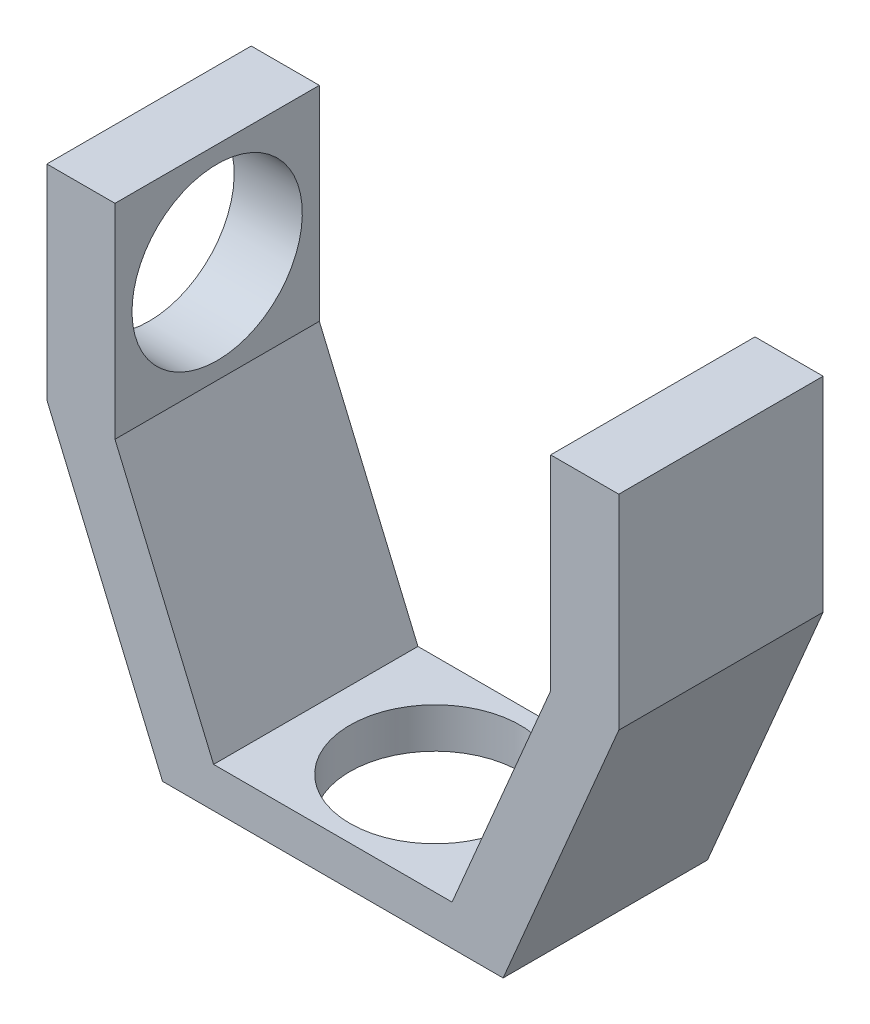
ISO-10303-21;
HEADER;
FILE_DESCRIPTION(('STEP AP214'),'2;1');
FILE_NAME('part.step','',(''),(''),'','','');
FILE_SCHEMA(('AUTOMOTIVE_DESIGN { 1 0 10303 214 1 1 1 1 }'));
ENDSEC;
DATA;
#1=APPLICATION_CONTEXT('core data for automotive mechanical design processes');
#2=APPLICATION_PROTOCOL_DEFINITION('international standard','automotive_design',2000,#1);
#3=PRODUCT_CONTEXT('',#1,'mechanical');
#4=PRODUCT('Part','Part','',(#3));
#5=PRODUCT_RELATED_PRODUCT_CATEGORY('part','',(#4));
#6=PRODUCT_DEFINITION_FORMATION('','',#4);
#7=PRODUCT_DEFINITION_CONTEXT('part definition',#1,'design');
#8=PRODUCT_DEFINITION('design','',#6,#7);
#9=PRODUCT_DEFINITION_SHAPE('','',#8);
#10=(LENGTH_UNIT() NAMED_UNIT(*) SI_UNIT(.MILLI.,.METRE.));
#11=(NAMED_UNIT(*) PLANE_ANGLE_UNIT() SI_UNIT($,.RADIAN.));
#12=(NAMED_UNIT(*) SI_UNIT($,.STERADIAN.) SOLID_ANGLE_UNIT());
#13=UNCERTAINTY_MEASURE_WITH_UNIT(LENGTH_MEASURE(1.E-05),#10,'distance_accuracy_value','');
#14=(GEOMETRIC_REPRESENTATION_CONTEXT(3) GLOBAL_UNCERTAINTY_ASSIGNED_CONTEXT((#13)) GLOBAL_UNIT_ASSIGNED_CONTEXT((#10,
#11,#12)) REPRESENTATION_CONTEXT('',''));
#15=CARTESIAN_POINT('',(0.,0.,0.));
#16=DIRECTION('',(0.,0.,1.));
#17=DIRECTION('',(1.,0.,0.));
#18=AXIS2_PLACEMENT_3D('',#15,#16,#17);
#19=CARTESIAN_POINT('',(6.13187876566639,76.9672773490026,60.));
#20=DIRECTION('',(0.,-1.,0.));
#21=DIRECTION('',(0.,0.,-1.));
#22=AXIS2_PLACEMENT_3D('',#19,#20,#21);
#23=PLANE('',#22);
#24=DIRECTION('',(-1.,0.,0.));
#25=VECTOR('',#24,1.);
#26=CARTESIAN_POINT('',(6.13187876566639,76.9672773490026,0.));
#27=LINE('',#26,#25);
#28=CARTESIAN_POINT('',(6.13187876566639,76.9672773490026,0.));
#29=VERTEX_POINT('',#28);
#30=CARTESIAN_POINT('',(-13.8681212343336,76.9672773490026,0.));
#31=VERTEX_POINT('',#30);
#32=EDGE_CURVE('E149',#29,#31,#27,.T.);
#33=ORIENTED_EDGE('',*,*,#32,.T.);
#34=DIRECTION('',(0.,0.,1.));
#35=VECTOR('',#34,1.);
#36=CARTESIAN_POINT('',(-13.8681212343336,76.9672773490026,0.));
#37=LINE('',#36,#35);
#38=CARTESIAN_POINT('',(-13.8681212343336,76.9672773490026,60.));
#39=VERTEX_POINT('',#38);
#40=EDGE_CURVE('E148',#31,#39,#37,.T.);
#41=ORIENTED_EDGE('',*,*,#40,.T.);
#42=DIRECTION('',(-1.,0.,0.));
#43=VECTOR('',#42,1.);
#44=CARTESIAN_POINT('',(6.13187876566639,76.9672773490026,60.));
#45=LINE('',#44,#43);
#46=CARTESIAN_POINT('',(6.13187876566639,76.9672773490026,60.));
#47=VERTEX_POINT('',#46);
#48=EDGE_CURVE('E99',#47,#39,#45,.T.);
#49=ORIENTED_EDGE('',*,*,#48,.F.);
#50=DIRECTION('',(0.,0.,-1.));
#51=VECTOR('',#50,1.);
#52=CARTESIAN_POINT('',(6.13187876566639,76.9672773490026,60.));
#53=LINE('',#52,#51);
#54=EDGE_CURVE('E11',#47,#29,#53,.T.);
#55=ORIENTED_EDGE('',*,*,#54,.T.);
#56=EDGE_LOOP('',(#33,#41,#49,#55));
#57=FACE_BOUND('',#56,.T.);
#58=ADVANCED_FACE('F39',(#57),#23,.F.);
#59=CARTESIAN_POINT('',(6.13187876566639,16.9672773490026,60.));
#60=DIRECTION('',(-1.,0.,0.));
#61=DIRECTION('',(0.,0.,1.));
#62=AXIS2_PLACEMENT_3D('',#59,#60,#61);
#63=PLANE('',#62);
#64=DIRECTION('',(0.,1.,0.));
#65=VECTOR('',#64,1.);
#66=CARTESIAN_POINT('',(6.13187876566639,16.9672773490026,0.));
#67=LINE('',#66,#65);
#68=CARTESIAN_POINT('',(6.13187876566639,16.9672773490026,0.));
#69=VERTEX_POINT('',#68);
#70=EDGE_CURVE('E143',#69,#29,#67,.T.);
#71=ORIENTED_EDGE('',*,*,#70,.T.);
#72=ORIENTED_EDGE('',*,*,#54,.F.);
#73=DIRECTION('',(0.,1.,0.));
#74=VECTOR('',#73,1.);
#75=CARTESIAN_POINT('',(6.13187876566639,16.9672773490026,60.));
#76=LINE('',#75,#74);
#77=CARTESIAN_POINT('',(6.13187876566639,16.9672773490026,60.));
#78=VERTEX_POINT('',#77);
#79=EDGE_CURVE('E163',#78,#47,#76,.T.);
#80=ORIENTED_EDGE('',*,*,#79,.F.);
#81=DIRECTION('',(0.,0.,-1.));
#82=VECTOR('',#81,1.);
#83=CARTESIAN_POINT('',(6.13187876566639,16.9672773490026,60.));
#84=LINE('',#83,#82);
#85=EDGE_CURVE('E139',#78,#69,#84,.T.);
#86=ORIENTED_EDGE('',*,*,#85,.T.);
#87=EDGE_LOOP('',(#71,#72,#80,#86));
#88=FACE_BOUND('',#87,.T.);
#89=ADVANCED_FACE('F41',(#88),#63,.F.);
#90=CARTESIAN_POINT('',(-141.78409182787,76.9672773490026,60.));
#91=VERTEX_POINT('',#90);
#92=CARTESIAN_POINT('',(-161.78409182787,76.9672773490026,60.));
#93=VERTEX_POINT('',#92);
#94=EDGE_CURVE('E189',#91,#93,#45,.T.);
#95=ORIENTED_EDGE('',*,*,#94,.F.);
#96=DIRECTION('',(0.,0.,1.));
#97=VECTOR('',#96,1.);
#98=CARTESIAN_POINT('',(-141.78409182787,76.9672773490026,0.));
#99=LINE('',#98,#97);
#100=CARTESIAN_POINT('',(-141.78409182787,76.9672773490026,0.));
#101=VERTEX_POINT('',#100);
#102=EDGE_CURVE('E194',#101,#91,#99,.T.);
#103=ORIENTED_EDGE('',*,*,#102,.F.);
#104=CARTESIAN_POINT('',(-161.78409182787,76.9672773490026,0.));
#105=VERTEX_POINT('',#104);
#106=EDGE_CURVE('E147',#101,#105,#27,.T.);
#107=ORIENTED_EDGE('',*,*,#106,.T.);
#108=DIRECTION('',(0.,0.,-1.));
#109=VECTOR('',#108,1.);
#110=CARTESIAN_POINT('',(-161.78409182787,76.9672773490026,60.));
#111=LINE('',#110,#109);
#112=EDGE_CURVE('E48',#93,#105,#111,.T.);
#113=ORIENTED_EDGE('',*,*,#112,.F.);
#114=EDGE_LOOP('',(#95,#103,#107,#113));
#115=FACE_BOUND('',#114,.T.);
#116=ADVANCED_FACE('F289',(#115),#23,.F.);
#117=CARTESIAN_POINT('',(-161.78409182787,76.9672773490026,60.));
#118=DIRECTION('',(1.,0.,0.));
#119=DIRECTION('',(0.,1.,0.));
#120=AXIS2_PLACEMENT_3D('',#117,#118,#119);
#121=PLANE('',#120);
#122=CARTESIAN_POINT('',(-161.78409182787,46.9672773490026,30.));
#123=DIRECTION('',(-1.,0.,0.));
#124=DIRECTION('',(0.,-1.,0.));
#125=AXIS2_PLACEMENT_3D('',#122,#123,#124);
#126=CIRCLE('',#125,25.);
#127=CARTESIAN_POINT('',(-161.78409182787,21.9672773490026,30.));
#128=VERTEX_POINT('',#127);
#129=EDGE_CURVE('E415',#128,#128,#126,.T.);
#130=ORIENTED_EDGE('',*,*,#129,.F.);
#131=EDGE_LOOP('',(#130));
#132=FACE_BOUND('',#131,.T.);
#133=DIRECTION('',(0.,-1.,0.));
#134=VECTOR('',#133,1.);
#135=CARTESIAN_POINT('',(-161.78409182787,76.9672773490026,0.));
#136=LINE('',#135,#134);
#137=CARTESIAN_POINT('',(-161.78409182787,16.9672773490026,0.));
#138=VERTEX_POINT('',#137);
#139=EDGE_CURVE('E153',#105,#138,#136,.T.);
#140=ORIENTED_EDGE('',*,*,#139,.T.);
#141=DIRECTION('',(0.,0.,-1.));
#142=VECTOR('',#141,1.);
#143=CARTESIAN_POINT('',(-161.78409182787,16.9672773490026,60.));
#144=LINE('',#143,#142);
#145=CARTESIAN_POINT('',(-161.78409182787,16.9672773490026,60.));
#146=VERTEX_POINT('',#145);
#147=EDGE_CURVE('E132',#146,#138,#144,.T.);
#148=ORIENTED_EDGE('',*,*,#147,.F.);
#149=DIRECTION('',(0.,-1.,0.));
#150=VECTOR('',#149,1.);
#151=CARTESIAN_POINT('',(-161.78409182787,76.9672773490026,60.));
#152=LINE('',#151,#150);
#153=EDGE_CURVE('E118',#93,#146,#152,.T.);
#154=ORIENTED_EDGE('',*,*,#153,.F.);
#155=ORIENTED_EDGE('',*,*,#112,.T.);
#156=EDGE_LOOP('',(#140,#148,#154,#155));
#157=FACE_BOUND('',#156,.T.);
#158=ADVANCED_FACE('F174',(#132,#157),#121,.F.);
#159=CARTESIAN_POINT('',(-161.78409182787,16.9672773490026,60.));
#160=DIRECTION('',(0.920504853452441,0.390731128489271,0.));
#161=DIRECTION('',(-0.390731128489271,0.920504853452442,0.));
#162=AXIS2_PLACEMENT_3D('',#159,#160,#161);
#163=PLANE('',#162);
#164=DIRECTION('',(0.390731128489271,-0.920504853452441,0.));
#165=VECTOR('',#164,1.);
#166=CARTESIAN_POINT('',(-161.78409182787,16.9672773490026,0.));
#167=LINE('',#166,#165);
#168=CARTESIAN_POINT('',(-127.826106531102,-63.0327226509974,0.));
#169=VERTEX_POINT('',#168);
#170=EDGE_CURVE('E128',#138,#169,#167,.T.);
#171=ORIENTED_EDGE('',*,*,#170,.T.);
#172=DIRECTION('',(0.,0.,-1.));
#173=VECTOR('',#172,1.);
#174=CARTESIAN_POINT('',(-127.826106531102,-63.0327226509974,60.));
#175=LINE('',#174,#173);
#176=CARTESIAN_POINT('',(-127.826106531102,-63.0327226509974,60.));
#177=VERTEX_POINT('',#176);
#178=EDGE_CURVE('E125',#177,#169,#175,.T.);
#179=ORIENTED_EDGE('',*,*,#178,.F.);
#180=DIRECTION('',(0.390731128489271,-0.920504853452441,0.));
#181=VECTOR('',#180,1.);
#182=CARTESIAN_POINT('',(-161.78409182787,16.9672773490026,60.));
#183=LINE('',#182,#181);
#184=EDGE_CURVE('E110',#146,#177,#183,.T.);
#185=ORIENTED_EDGE('',*,*,#184,.F.);
#186=ORIENTED_EDGE('',*,*,#147,.T.);
#187=EDGE_LOOP('',(#171,#179,#185,#186));
#188=FACE_BOUND('',#187,.T.);
#189=ADVANCED_FACE('F126',(#188),#163,.F.);
#190=CARTESIAN_POINT('',(-127.826106531102,-63.0327226509974,60.));
#191=DIRECTION('',(0.,1.,0.));
#192=DIRECTION('',(0.,0.,1.));
#193=AXIS2_PLACEMENT_3D('',#190,#191,#192);
#194=PLANE('',#193);
#195=CARTESIAN_POINT('',(-77.8157720357696,-63.0327226509974,30.));
#196=DIRECTION('',(0.,1.,0.));
#197=DIRECTION('',(0.,0.,1.));
#198=AXIS2_PLACEMENT_3D('',#195,#196,#197);
#199=CIRCLE('',#198,25.);
#200=CARTESIAN_POINT('',(-77.8157720357696,-63.0327226509974,55.));
#201=VERTEX_POINT('',#200);
#202=EDGE_CURVE('E413',#201,#201,#199,.T.);
#203=ORIENTED_EDGE('',*,*,#202,.T.);
#204=EDGE_LOOP('',(#203));
#205=FACE_BOUND('',#204,.T.);
#206=DIRECTION('',(1.,0.,0.));
#207=VECTOR('',#206,1.);
#208=CARTESIAN_POINT('',(-127.826106531102,-63.0327226509974,0.));
#209=LINE('',#208,#207);
#210=CARTESIAN_POINT('',(-27.8261065311017,-63.0327226509974,0.));
#211=VERTEX_POINT('',#210);
#212=EDGE_CURVE('E158',#169,#211,#209,.T.);
#213=ORIENTED_EDGE('',*,*,#212,.T.);
#214=DIRECTION('',(0.,0.,-1.));
#215=VECTOR('',#214,1.);
#216=CARTESIAN_POINT('',(-27.8261065311017,-63.0327226509974,60.));
#217=LINE('',#216,#215);
#218=CARTESIAN_POINT('',(-27.8261065311017,-63.0327226509974,60.));
#219=VERTEX_POINT('',#218);
#220=EDGE_CURVE('E133',#219,#211,#217,.T.);
#221=ORIENTED_EDGE('',*,*,#220,.F.);
#222=DIRECTION('',(1.,0.,0.));
#223=VECTOR('',#222,1.);
#224=CARTESIAN_POINT('',(-127.826106531102,-63.0327226509974,60.));
#225=LINE('',#224,#223);
#226=EDGE_CURVE('E115',#177,#219,#225,.T.);
#227=ORIENTED_EDGE('',*,*,#226,.F.);
#228=ORIENTED_EDGE('',*,*,#178,.T.);
#229=EDGE_LOOP('',(#213,#221,#227,#228));
#230=FACE_BOUND('',#229,.T.);
#231=ADVANCED_FACE('F135',(#205,#230),#194,.F.);
#232=CARTESIAN_POINT('',(-27.8261065311017,-63.0327226509974,60.));
#233=DIRECTION('',(-0.920504853452441,0.390731128489271,0.));
#234=DIRECTION('',(-0.390731128489271,-0.920504853452442,0.));
#235=AXIS2_PLACEMENT_3D('',#232,#233,#234);
#236=PLANE('',#235);
#237=DIRECTION('',(0.390731128489271,0.920504853452441,0.));
#238=VECTOR('',#237,1.);
#239=CARTESIAN_POINT('',(-27.8261065311017,-63.0327226509974,0.));
#240=LINE('',#239,#238);
#241=EDGE_CURVE('E91',#211,#69,#240,.T.);
#242=ORIENTED_EDGE('',*,*,#241,.T.);
#243=ORIENTED_EDGE('',*,*,#85,.F.);
#244=DIRECTION('',(0.390731128489271,0.920504853452441,0.));
#245=VECTOR('',#244,1.);
#246=CARTESIAN_POINT('',(-27.8261065311017,-63.0327226509974,60.));
#247=LINE('',#246,#245);
#248=EDGE_CURVE('E64',#219,#78,#247,.T.);
#249=ORIENTED_EDGE('',*,*,#248,.F.);
#250=ORIENTED_EDGE('',*,*,#220,.T.);
#251=EDGE_LOOP('',(#242,#243,#249,#250));
#252=FACE_BOUND('',#251,.T.);
#253=ADVANCED_FACE('F184',(#252),#236,.F.);
#254=CARTESIAN_POINT('',(0.,0.,60.));
#255=DIRECTION('',(0.,0.,1.));
#256=DIRECTION('',(1.,0.,0.));
#257=AXIS2_PLACEMENT_3D('',#254,#255,#256);
#258=PLANE('',#257);
#259=DIRECTION('',(0.,1.,0.));
#260=VECTOR('',#259,1.);
#261=CARTESIAN_POINT('',(-13.8681212343336,76.9672773490026,60.));
#262=LINE('',#261,#260);
#263=CARTESIAN_POINT('',(-13.8681212343336,16.9672773490026,60.));
#264=VERTEX_POINT('',#263);
#265=EDGE_CURVE('E201',#264,#39,#262,.T.);
#266=ORIENTED_EDGE('',*,*,#265,.F.);
#267=DIRECTION('',(0.390731128489271,0.920504853452442,0.));
#268=VECTOR('',#267,1.);
#269=CARTESIAN_POINT('',(-42.8157720357696,-51.2291142766008,60.));
#270=LINE('',#269,#268);
#271=CARTESIAN_POINT('',(-42.8157720357696,-51.2291142766008,60.));
#272=VERTEX_POINT('',#271);
#273=EDGE_CURVE('E273',#272,#264,#270,.T.);
#274=ORIENTED_EDGE('',*,*,#273,.F.);
#275=DIRECTION('',(1.,0.,0.));
#276=VECTOR('',#275,1.);
#277=CARTESIAN_POINT('',(-112.836441026434,-51.2291142766008,60.));
#278=LINE('',#277,#276);
#279=CARTESIAN_POINT('',(-112.836441026434,-51.2291142766008,60.));
#280=VERTEX_POINT('',#279);
#281=EDGE_CURVE('E270',#280,#272,#278,.T.);
#282=ORIENTED_EDGE('',*,*,#281,.F.);
#283=DIRECTION('',(0.390731128489271,-0.920504853452441,0.));
#284=VECTOR('',#283,1.);
#285=CARTESIAN_POINT('',(-141.78409182787,16.9672773490026,60.));
#286=LINE('',#285,#284);
#287=CARTESIAN_POINT('',(-141.78409182787,16.9672773490026,60.));
#288=VERTEX_POINT('',#287);
#289=EDGE_CURVE('E235',#288,#280,#286,.T.);
#290=ORIENTED_EDGE('',*,*,#289,.F.);
#291=DIRECTION('',(0.,-1.,0.));
#292=VECTOR('',#291,1.);
#293=CARTESIAN_POINT('',(-141.78409182787,76.9672773490026,60.));
#294=LINE('',#293,#292);
#295=EDGE_CURVE('E263',#91,#288,#294,.T.);
#296=ORIENTED_EDGE('',*,*,#295,.F.);
#297=ORIENTED_EDGE('',*,*,#94,.T.);
#298=ORIENTED_EDGE('',*,*,#153,.T.);
#299=ORIENTED_EDGE('',*,*,#184,.T.);
#300=ORIENTED_EDGE('',*,*,#226,.T.);
#301=ORIENTED_EDGE('',*,*,#248,.T.);
#302=ORIENTED_EDGE('',*,*,#79,.T.);
#303=ORIENTED_EDGE('',*,*,#48,.T.);
#304=EDGE_LOOP('',(#266,#274,#282,#290,#296,#297,#298,#299,#300,#301,#302,#303));
#305=FACE_BOUND('',#304,.T.);
#306=ADVANCED_FACE('F113',(#305),#258,.T.);
#307=CARTESIAN_POINT('',(0.,0.,0.));
#308=DIRECTION('',(0.,0.,1.));
#309=DIRECTION('',(1.,0.,0.));
#310=AXIS2_PLACEMENT_3D('',#307,#308,#309);
#311=PLANE('',#310);
#312=DIRECTION('',(0.390731128489271,0.920504853452442,0.));
#313=VECTOR('',#312,1.);
#314=CARTESIAN_POINT('',(-42.8157720357696,-51.2291142766008,0.));
#315=LINE('',#314,#313);
#316=CARTESIAN_POINT('',(-42.8157720357696,-51.2291142766008,0.));
#317=VERTEX_POINT('',#316);
#318=CARTESIAN_POINT('',(-13.8681212343336,16.9672773490026,0.));
#319=VERTEX_POINT('',#318);
#320=EDGE_CURVE('E248',#317,#319,#315,.T.);
#321=ORIENTED_EDGE('',*,*,#320,.T.);
#322=DIRECTION('',(0.,1.,0.));
#323=VECTOR('',#322,1.);
#324=CARTESIAN_POINT('',(-13.8681212343336,76.9672773490026,0.));
#325=LINE('',#324,#323);
#326=EDGE_CURVE('E259',#319,#31,#325,.T.);
#327=ORIENTED_EDGE('',*,*,#326,.T.);
#328=ORIENTED_EDGE('',*,*,#32,.F.);
#329=ORIENTED_EDGE('',*,*,#70,.F.);
#330=ORIENTED_EDGE('',*,*,#241,.F.);
#331=ORIENTED_EDGE('',*,*,#212,.F.);
#332=ORIENTED_EDGE('',*,*,#170,.F.);
#333=ORIENTED_EDGE('',*,*,#139,.F.);
#334=ORIENTED_EDGE('',*,*,#106,.F.);
#335=DIRECTION('',(0.,-1.,0.));
#336=VECTOR('',#335,1.);
#337=CARTESIAN_POINT('',(-141.78409182787,76.9672773490026,0.));
#338=LINE('',#337,#336);
#339=CARTESIAN_POINT('',(-141.78409182787,16.9672773490026,0.));
#340=VERTEX_POINT('',#339);
#341=EDGE_CURVE('E250',#101,#340,#338,.T.);
#342=ORIENTED_EDGE('',*,*,#341,.T.);
#343=DIRECTION('',(0.390731128489271,-0.920504853452441,0.));
#344=VECTOR('',#343,1.);
#345=CARTESIAN_POINT('',(-141.78409182787,16.9672773490026,0.));
#346=LINE('',#345,#344);
#347=CARTESIAN_POINT('',(-112.836441026434,-51.2291142766008,0.));
#348=VERTEX_POINT('',#347);
#349=EDGE_CURVE('E55',#340,#348,#346,.T.);
#350=ORIENTED_EDGE('',*,*,#349,.T.);
#351=DIRECTION('',(1.,0.,0.));
#352=VECTOR('',#351,1.);
#353=CARTESIAN_POINT('',(-112.836441026434,-51.2291142766008,0.));
#354=LINE('',#353,#352);
#355=EDGE_CURVE('E244',#348,#317,#354,.T.);
#356=ORIENTED_EDGE('',*,*,#355,.T.);
#357=EDGE_LOOP('',(#321,#327,#328,#329,#330,#331,#332,#333,#334,#342,#350,#356));
#358=FACE_BOUND('',#357,.T.);
#359=ADVANCED_FACE('F180',(#358),#311,.F.);
#360=CARTESIAN_POINT('',(-13.8681212343336,76.9672773490026,0.));
#361=DIRECTION('',(1.,0.,0.));
#362=DIRECTION('',(0.,1.,0.));
#363=AXIS2_PLACEMENT_3D('',#360,#361,#362);
#364=PLANE('',#363);
#365=ORIENTED_EDGE('',*,*,#265,.T.);
#366=ORIENTED_EDGE('',*,*,#40,.F.);
#367=ORIENTED_EDGE('',*,*,#326,.F.);
#368=DIRECTION('',(0.,0.,1.));
#369=VECTOR('',#368,1.);
#370=CARTESIAN_POINT('',(-13.8681212343336,16.9672773490026,0.));
#371=LINE('',#370,#369);
#372=EDGE_CURVE('E211',#319,#264,#371,.T.);
#373=ORIENTED_EDGE('',*,*,#372,.T.);
#374=EDGE_LOOP('',(#365,#366,#367,#373));
#375=FACE_BOUND('',#374,.T.);
#376=ADVANCED_FACE('F300',(#375),#364,.F.);
#377=CARTESIAN_POINT('',(-42.8157720357696,-51.2291142766008,0.));
#378=DIRECTION('',(0.920504853452441,-0.390731128489271,0.));
#379=DIRECTION('',(0.390731128489271,0.920504853452442,0.));
#380=AXIS2_PLACEMENT_3D('',#377,#378,#379);
#381=PLANE('',#380);
#382=ORIENTED_EDGE('',*,*,#273,.T.);
#383=ORIENTED_EDGE('',*,*,#372,.F.);
#384=ORIENTED_EDGE('',*,*,#320,.F.);
#385=DIRECTION('',(0.,0.,1.));
#386=VECTOR('',#385,1.);
#387=CARTESIAN_POINT('',(-42.8157720357696,-51.2291142766008,0.));
#388=LINE('',#387,#386);
#389=EDGE_CURVE('E240',#317,#272,#388,.T.);
#390=ORIENTED_EDGE('',*,*,#389,.T.);
#391=EDGE_LOOP('',(#382,#383,#384,#390));
#392=FACE_BOUND('',#391,.T.);
#393=ADVANCED_FACE('F302',(#392),#381,.F.);
#394=CARTESIAN_POINT('',(-112.836441026434,-51.2291142766008,0.));
#395=DIRECTION('',(0.,-1.,0.));
#396=DIRECTION('',(0.,0.,-1.));
#397=AXIS2_PLACEMENT_3D('',#394,#395,#396);
#398=PLANE('',#397);
#399=CARTESIAN_POINT('',(-77.8157720357696,-51.2291142766008,30.));
#400=DIRECTION('',(0.,1.,0.));
#401=DIRECTION('',(0.,0.,1.));
#402=AXIS2_PLACEMENT_3D('',#399,#400,#401);
#403=CIRCLE('',#402,25.);
#404=CARTESIAN_POINT('',(-77.8157720357696,-51.2291142766008,55.));
#405=VERTEX_POINT('',#404);
#406=EDGE_CURVE('E410',#405,#405,#403,.T.);
#407=ORIENTED_EDGE('',*,*,#406,.F.);
#408=EDGE_LOOP('',(#407));
#409=FACE_BOUND('',#408,.T.);
#410=ORIENTED_EDGE('',*,*,#281,.T.);
#411=ORIENTED_EDGE('',*,*,#389,.F.);
#412=ORIENTED_EDGE('',*,*,#355,.F.);
#413=DIRECTION('',(0.,0.,1.));
#414=VECTOR('',#413,1.);
#415=CARTESIAN_POINT('',(-112.836441026434,-51.2291142766008,0.));
#416=LINE('',#415,#414);
#417=EDGE_CURVE('E231',#348,#280,#416,.T.);
#418=ORIENTED_EDGE('',*,*,#417,.T.);
#419=EDGE_LOOP('',(#410,#411,#412,#418));
#420=FACE_BOUND('',#419,.T.);
#421=ADVANCED_FACE('F245',(#409,#420),#398,.F.);
#422=CARTESIAN_POINT('',(-141.78409182787,16.9672773490026,0.));
#423=DIRECTION('',(-0.920504853452441,-0.390731128489271,0.));
#424=DIRECTION('',(0.390731128489271,-0.920504853452441,0.));
#425=AXIS2_PLACEMENT_3D('',#422,#423,#424);
#426=PLANE('',#425);
#427=ORIENTED_EDGE('',*,*,#289,.T.);
#428=ORIENTED_EDGE('',*,*,#417,.F.);
#429=ORIENTED_EDGE('',*,*,#349,.F.);
#430=DIRECTION('',(0.,0.,1.));
#431=VECTOR('',#430,1.);
#432=CARTESIAN_POINT('',(-141.78409182787,16.9672773490026,0.));
#433=LINE('',#432,#431);
#434=EDGE_CURVE('E241',#340,#288,#433,.T.);
#435=ORIENTED_EDGE('',*,*,#434,.T.);
#436=EDGE_LOOP('',(#427,#428,#429,#435));
#437=FACE_BOUND('',#436,.T.);
#438=ADVANCED_FACE('F233',(#437),#426,.F.);
#439=CARTESIAN_POINT('',(-141.78409182787,76.9672773490026,0.));
#440=DIRECTION('',(-1.,0.,0.));
#441=DIRECTION('',(0.,0.,1.));
#442=AXIS2_PLACEMENT_3D('',#439,#440,#441);
#443=PLANE('',#442);
#444=CARTESIAN_POINT('',(-141.78409182787,46.9672773490026,30.));
#445=DIRECTION('',(-1.,0.,0.));
#446=DIRECTION('',(0.,-1.,0.));
#447=AXIS2_PLACEMENT_3D('',#444,#445,#446);
#448=CIRCLE('',#447,25.);
#449=CARTESIAN_POINT('',(-141.78409182787,21.9672773490026,30.));
#450=VERTEX_POINT('',#449);
#451=EDGE_CURVE('E267',#450,#450,#448,.T.);
#452=ORIENTED_EDGE('',*,*,#451,.T.);
#453=EDGE_LOOP('',(#452));
#454=FACE_BOUND('',#453,.T.);
#455=ORIENTED_EDGE('',*,*,#295,.T.);
#456=ORIENTED_EDGE('',*,*,#434,.F.);
#457=ORIENTED_EDGE('',*,*,#341,.F.);
#458=ORIENTED_EDGE('',*,*,#102,.T.);
#459=EDGE_LOOP('',(#455,#456,#457,#458));
#460=FACE_BOUND('',#459,.T.);
#461=ADVANCED_FACE('F288',(#454,#460),#443,.F.);
#462=CARTESIAN_POINT('',(-141.78409182787,46.9672773490026,30.));
#463=DIRECTION('',(-1.,0.,0.));
#464=DIRECTION('',(0.,-1.,0.));
#465=AXIS2_PLACEMENT_3D('',#462,#463,#464);
#466=CYLINDRICAL_SURFACE('',#465,25.);
#467=ORIENTED_EDGE('',*,*,#451,.F.);
#468=EDGE_LOOP('',(#467));
#469=FACE_BOUND('',#468,.T.);
#470=ORIENTED_EDGE('',*,*,#129,.T.);
#471=EDGE_LOOP('',(#470));
#472=FACE_BOUND('',#471,.T.);
#473=ADVANCED_FACE('F312',(#469,#472),#466,.F.);
#474=CARTESIAN_POINT('',(-77.8157720357696,-71.2291142766008,30.));
#475=DIRECTION('',(0.,1.,0.));
#476=DIRECTION('',(0.,0.,1.));
#477=AXIS2_PLACEMENT_3D('',#474,#475,#476);
#478=CYLINDRICAL_SURFACE('',#477,25.);
#479=ORIENTED_EDGE('',*,*,#406,.T.);
#480=EDGE_LOOP('',(#479));
#481=FACE_BOUND('',#480,.T.);
#482=ORIENTED_EDGE('',*,*,#202,.F.);
#483=EDGE_LOOP('',(#482));
#484=FACE_BOUND('',#483,.T.);
#485=ADVANCED_FACE('F390',(#481,#484),#478,.F.);
#486=CLOSED_SHELL('',(#58,#89,#116,#158,#189,#231,#253,#306,#359,#376,#393,#421,#438,#461,#473,#485));
#487=MANIFOLD_SOLID_BREP('B2',#486);
#488=ADVANCED_BREP_SHAPE_REPRESENTATION('',(#18,#487),#14);
#489=SHAPE_DEFINITION_REPRESENTATION(#9,#488);
ENDSEC;
END-ISO-10303-21;
